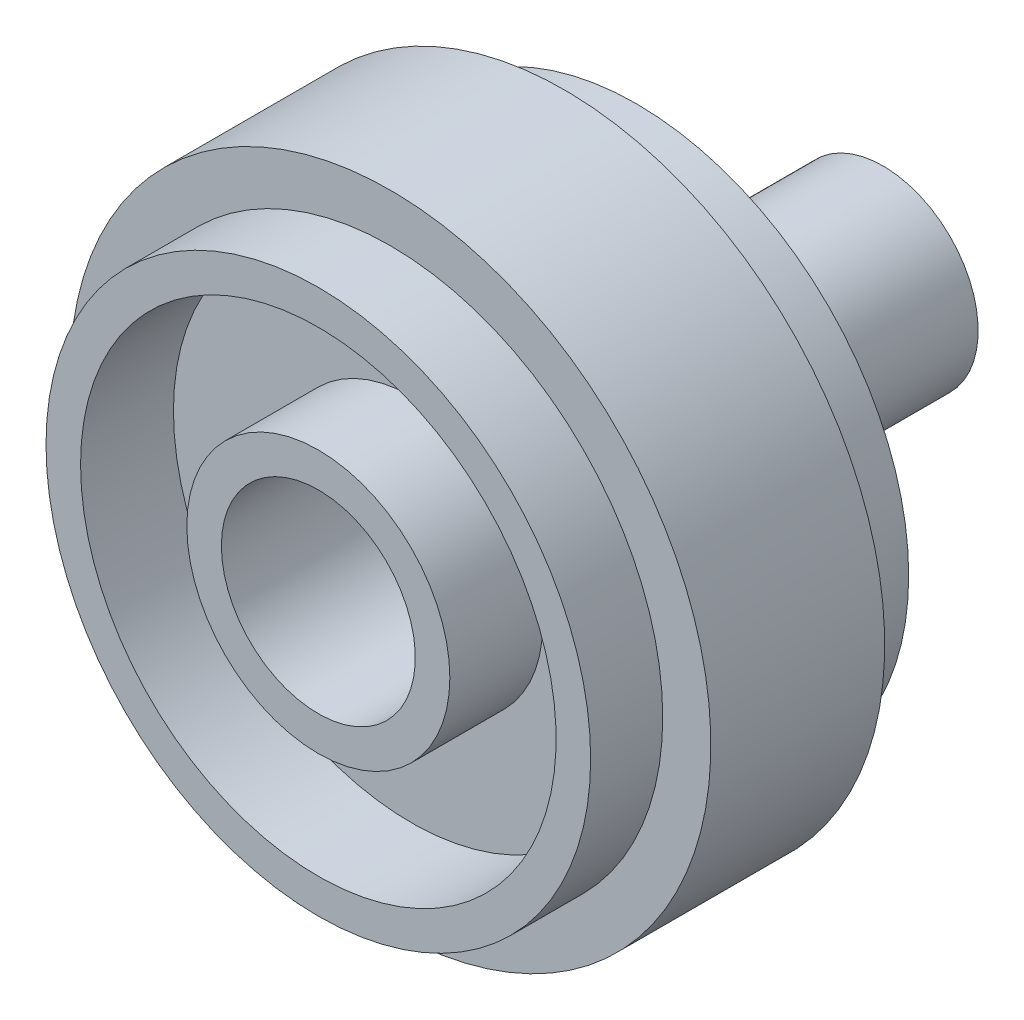
ISO-10303-21;
HEADER;
FILE_DESCRIPTION(('STEP AP214'),'2;1');
FILE_NAME('part.step','',(''),(''),'','','');
FILE_SCHEMA(('AUTOMOTIVE_DESIGN { 1 0 10303 214 1 1 1 1 }'));
ENDSEC;
DATA;
#1=APPLICATION_CONTEXT('core data for automotive mechanical design processes');
#2=APPLICATION_PROTOCOL_DEFINITION('international standard','automotive_design',2000,#1);
#3=PRODUCT_CONTEXT('',#1,'mechanical');
#4=PRODUCT('Part','Part','',(#3));
#5=PRODUCT_RELATED_PRODUCT_CATEGORY('part','',(#4));
#6=PRODUCT_DEFINITION_FORMATION('','',#4);
#7=PRODUCT_DEFINITION_CONTEXT('part definition',#1,'design');
#8=PRODUCT_DEFINITION('design','',#6,#7);
#9=PRODUCT_DEFINITION_SHAPE('','',#8);
#10=(LENGTH_UNIT() NAMED_UNIT(*) SI_UNIT(.MILLI.,.METRE.));
#11=(NAMED_UNIT(*) PLANE_ANGLE_UNIT() SI_UNIT($,.RADIAN.));
#12=(NAMED_UNIT(*) SI_UNIT($,.STERADIAN.) SOLID_ANGLE_UNIT());
#13=UNCERTAINTY_MEASURE_WITH_UNIT(LENGTH_MEASURE(1.E-05),#10,'distance_accuracy_value','');
#14=(GEOMETRIC_REPRESENTATION_CONTEXT(3) GLOBAL_UNCERTAINTY_ASSIGNED_CONTEXT((#13)) GLOBAL_UNIT_ASSIGNED_CONTEXT((#10,
#11,#12)) REPRESENTATION_CONTEXT('',''));
#15=CARTESIAN_POINT('',(0.,0.,0.));
#16=DIRECTION('',(0.,0.,1.));
#17=DIRECTION('',(1.,0.,0.));
#18=AXIS2_PLACEMENT_3D('',#15,#16,#17);
#19=CARTESIAN_POINT('',(0.,9.3091,-2.9718));
#20=DIRECTION('',(0.,0.,-1.));
#21=DIRECTION('',(-1.,0.,0.));
#22=AXIS2_PLACEMENT_3D('',#19,#20,#21);
#23=PLANE('',#22);
#24=CARTESIAN_POINT('',(0.,0.,-2.9718));
#25=DIRECTION('',(0.,0.,-1.));
#26=DIRECTION('',(-1.,0.,0.));
#27=AXIS2_PLACEMENT_3D('',#24,#25,#26);
#28=CIRCLE('',#27,10.95375);
#29=CARTESIAN_POINT('',(-10.95375,0.,-2.9718));
#30=VERTEX_POINT('',#29);
#31=EDGE_CURVE('E10',#30,#30,#28,.T.);
#32=ORIENTED_EDGE('',*,*,#31,.T.);
#33=EDGE_LOOP('',(#32));
#34=FACE_BOUND('',#33,.T.);
#35=CARTESIAN_POINT('',(0.,0.,-2.9718));
#36=DIRECTION('',(0.,0.,-1.));
#37=DIRECTION('',(-1.,0.,0.));
#38=AXIS2_PLACEMENT_3D('',#35,#36,#37);
#39=CIRCLE('',#38,9.3091);
#40=CARTESIAN_POINT('',(-9.3091,0.,-2.9718));
#41=VERTEX_POINT('',#40);
#42=EDGE_CURVE('E95',#41,#41,#39,.T.);
#43=ORIENTED_EDGE('',*,*,#42,.F.);
#44=EDGE_LOOP('',(#43));
#45=FACE_BOUND('',#44,.T.);
#46=ADVANCED_FACE('F31',(#34,#45),#23,.T.);
#47=CARTESIAN_POINT('',(0.,0.,0.));
#48=DIRECTION('',(0.,0.,-1.));
#49=DIRECTION('',(-1.,0.,0.));
#50=AXIS2_PLACEMENT_3D('',#47,#48,#49);
#51=CYLINDRICAL_SURFACE('',#50,10.95375);
#52=CARTESIAN_POINT('',(0.,0.,2.9718));
#53=DIRECTION('',(0.,0.,-1.));
#54=DIRECTION('',(-1.,0.,0.));
#55=AXIS2_PLACEMENT_3D('',#52,#53,#54);
#56=CIRCLE('',#55,10.95375);
#57=CARTESIAN_POINT('',(-10.95375,0.,2.9718));
#58=VERTEX_POINT('',#57);
#59=EDGE_CURVE('E37',#58,#58,#56,.T.);
#60=ORIENTED_EDGE('',*,*,#59,.T.);
#61=EDGE_LOOP('',(#60));
#62=FACE_BOUND('',#61,.T.);
#63=ORIENTED_EDGE('',*,*,#31,.F.);
#64=EDGE_LOOP('',(#63));
#65=FACE_BOUND('',#64,.T.);
#66=ADVANCED_FACE('F103',(#62,#65),#51,.T.);
#67=CARTESIAN_POINT('',(0.,10.95375,2.9718));
#68=DIRECTION('',(0.,0.,1.));
#69=DIRECTION('',(1.,0.,0.));
#70=AXIS2_PLACEMENT_3D('',#67,#68,#69);
#71=PLANE('',#70);
#72=CARTESIAN_POINT('',(0.,0.,2.9718));
#73=DIRECTION('',(0.,0.,-1.));
#74=DIRECTION('',(-1.,0.,0.));
#75=AXIS2_PLACEMENT_3D('',#72,#73,#74);
#76=CIRCLE('',#75,9.3091);
#77=CARTESIAN_POINT('',(-9.3091,0.,2.9718));
#78=VERTEX_POINT('',#77);
#79=EDGE_CURVE('E41',#78,#78,#76,.T.);
#80=ORIENTED_EDGE('',*,*,#79,.T.);
#81=EDGE_LOOP('',(#80));
#82=FACE_BOUND('',#81,.T.);
#83=ORIENTED_EDGE('',*,*,#59,.F.);
#84=EDGE_LOOP('',(#83));
#85=FACE_BOUND('',#84,.T.);
#86=ADVANCED_FACE('F107',(#82,#85),#71,.T.);
#87=CARTESIAN_POINT('',(0.,0.,0.));
#88=DIRECTION('',(0.,0.,-1.));
#89=DIRECTION('',(-1.,0.,0.));
#90=AXIS2_PLACEMENT_3D('',#87,#88,#89);
#91=CYLINDRICAL_SURFACE('',#90,9.3091);
#92=CARTESIAN_POINT('',(0.,0.,5.4356));
#93=DIRECTION('',(0.,0.,-1.));
#94=DIRECTION('',(-1.,0.,0.));
#95=AXIS2_PLACEMENT_3D('',#92,#93,#94);
#96=CIRCLE('',#95,9.3091);
#97=CARTESIAN_POINT('',(-9.3091,0.,5.4356));
#98=VERTEX_POINT('',#97);
#99=EDGE_CURVE('E45',#98,#98,#96,.T.);
#100=ORIENTED_EDGE('',*,*,#99,.T.);
#101=EDGE_LOOP('',(#100));
#102=FACE_BOUND('',#101,.T.);
#103=ORIENTED_EDGE('',*,*,#79,.F.);
#104=EDGE_LOOP('',(#103));
#105=FACE_BOUND('',#104,.T.);
#106=ADVANCED_FACE('F111',(#102,#105),#91,.T.);
#107=CARTESIAN_POINT('',(0.,9.3091,5.4356));
#108=DIRECTION('',(0.,0.,1.));
#109=DIRECTION('',(1.,0.,0.));
#110=AXIS2_PLACEMENT_3D('',#107,#108,#109);
#111=PLANE('',#110);
#112=CARTESIAN_POINT('',(0.,0.,5.4356));
#113=DIRECTION('',(0.,0.,-1.));
#114=DIRECTION('',(-1.,0.,0.));
#115=AXIS2_PLACEMENT_3D('',#112,#113,#114);
#116=CIRCLE('',#115,8.128);
#117=CARTESIAN_POINT('',(-8.128,0.,5.4356));
#118=VERTEX_POINT('',#117);
#119=EDGE_CURVE('E50',#118,#118,#116,.T.);
#120=ORIENTED_EDGE('',*,*,#119,.T.);
#121=EDGE_LOOP('',(#120));
#122=FACE_BOUND('',#121,.T.);
#123=ORIENTED_EDGE('',*,*,#99,.F.);
#124=EDGE_LOOP('',(#123));
#125=FACE_BOUND('',#124,.T.);
#126=ADVANCED_FACE('F118',(#122,#125),#111,.T.);
#127=CARTESIAN_POINT('',(0.,0.,0.));
#128=DIRECTION('',(0.,0.,-1.));
#129=DIRECTION('',(-1.,0.,0.));
#130=AXIS2_PLACEMENT_3D('',#127,#128,#129);
#131=CYLINDRICAL_SURFACE('',#130,8.128);
#132=CARTESIAN_POINT('',(0.,0.,2.2606));
#133=DIRECTION('',(0.,0.,-1.));
#134=DIRECTION('',(-1.,0.,0.));
#135=AXIS2_PLACEMENT_3D('',#132,#133,#134);
#136=CIRCLE('',#135,8.128);
#137=CARTESIAN_POINT('',(-8.128,0.,2.2606));
#138=VERTEX_POINT('',#137);
#139=EDGE_CURVE('E53',#138,#138,#136,.T.);
#140=ORIENTED_EDGE('',*,*,#139,.T.);
#141=EDGE_LOOP('',(#140));
#142=FACE_BOUND('',#141,.T.);
#143=ORIENTED_EDGE('',*,*,#119,.F.);
#144=EDGE_LOOP('',(#143));
#145=FACE_BOUND('',#144,.T.);
#146=ADVANCED_FACE('F122',(#142,#145),#131,.F.);
#147=CARTESIAN_POINT('',(0.,8.128,2.2606));
#148=DIRECTION('',(0.,0.,1.));
#149=DIRECTION('',(1.,0.,0.));
#150=AXIS2_PLACEMENT_3D('',#147,#148,#149);
#151=PLANE('',#150);
#152=CARTESIAN_POINT('',(0.,0.,2.2606));
#153=DIRECTION('',(0.,0.,-1.));
#154=DIRECTION('',(-1.,0.,0.));
#155=AXIS2_PLACEMENT_3D('',#152,#153,#154);
#156=CIRCLE('',#155,4.4958);
#157=CARTESIAN_POINT('',(-4.4958,0.,2.2606));
#158=VERTEX_POINT('',#157);
#159=EDGE_CURVE('E56',#158,#158,#156,.T.);
#160=ORIENTED_EDGE('',*,*,#159,.T.);
#161=EDGE_LOOP('',(#160));
#162=FACE_BOUND('',#161,.T.);
#163=ORIENTED_EDGE('',*,*,#139,.F.);
#164=EDGE_LOOP('',(#163));
#165=FACE_BOUND('',#164,.T.);
#166=ADVANCED_FACE('F126',(#162,#165),#151,.T.);
#167=CARTESIAN_POINT('',(0.,0.,0.));
#168=DIRECTION('',(0.,0.,-1.));
#169=DIRECTION('',(-1.,0.,0.));
#170=AXIS2_PLACEMENT_3D('',#167,#168,#169);
#171=CYLINDRICAL_SURFACE('',#170,4.4958);
#172=CARTESIAN_POINT('',(0.,0.,5.4356));
#173=DIRECTION('',(0.,0.,-1.));
#174=DIRECTION('',(-1.,0.,0.));
#175=AXIS2_PLACEMENT_3D('',#172,#173,#174);
#176=CIRCLE('',#175,4.4958);
#177=CARTESIAN_POINT('',(-4.4958,0.,5.4356));
#178=VERTEX_POINT('',#177);
#179=EDGE_CURVE('E59',#178,#178,#176,.T.);
#180=ORIENTED_EDGE('',*,*,#179,.T.);
#181=EDGE_LOOP('',(#180));
#182=FACE_BOUND('',#181,.T.);
#183=ORIENTED_EDGE('',*,*,#159,.F.);
#184=EDGE_LOOP('',(#183));
#185=FACE_BOUND('',#184,.T.);
#186=ADVANCED_FACE('F130',(#182,#185),#171,.T.);
#187=CARTESIAN_POINT('',(0.,4.4958,5.4356));
#188=DIRECTION('',(0.,0.,1.));
#189=DIRECTION('',(1.,0.,0.));
#190=AXIS2_PLACEMENT_3D('',#187,#188,#189);
#191=PLANE('',#190);
#192=CARTESIAN_POINT('',(0.,0.,5.4356));
#193=DIRECTION('',(0.,0.,-1.));
#194=DIRECTION('',(-1.,0.,0.));
#195=AXIS2_PLACEMENT_3D('',#192,#193,#194);
#196=CIRCLE('',#195,3.3147);
#197=CARTESIAN_POINT('',(-3.3147,0.,5.4356));
#198=VERTEX_POINT('',#197);
#199=EDGE_CURVE('E62',#198,#198,#196,.T.);
#200=ORIENTED_EDGE('',*,*,#199,.T.);
#201=EDGE_LOOP('',(#200));
#202=FACE_BOUND('',#201,.T.);
#203=ORIENTED_EDGE('',*,*,#179,.F.);
#204=EDGE_LOOP('',(#203));
#205=FACE_BOUND('',#204,.T.);
#206=ADVANCED_FACE('F134',(#202,#205),#191,.T.);
#207=CARTESIAN_POINT('',(0.,0.,0.));
#208=DIRECTION('',(0.,0.,-1.));
#209=DIRECTION('',(-1.,0.,0.));
#210=AXIS2_PLACEMENT_3D('',#207,#208,#209);
#211=CYLINDRICAL_SURFACE('',#210,3.3147);
#212=CARTESIAN_POINT('',(0.,0.,-1.1938));
#213=DIRECTION('',(0.,0.,-1.));
#214=DIRECTION('',(-1.,0.,0.));
#215=AXIS2_PLACEMENT_3D('',#212,#213,#214);
#216=CIRCLE('',#215,3.3147);
#217=CARTESIAN_POINT('',(-3.3147,0.,-1.1938));
#218=VERTEX_POINT('',#217);
#219=EDGE_CURVE('E65',#218,#218,#216,.T.);
#220=ORIENTED_EDGE('',*,*,#219,.T.);
#221=EDGE_LOOP('',(#220));
#222=FACE_BOUND('',#221,.T.);
#223=ORIENTED_EDGE('',*,*,#199,.F.);
#224=EDGE_LOOP('',(#223));
#225=FACE_BOUND('',#224,.T.);
#226=ADVANCED_FACE('F138',(#222,#225),#211,.F.);
#227=CARTESIAN_POINT('',(0.,3.3147,-1.1938));
#228=DIRECTION('',(0.,0.,1.));
#229=DIRECTION('',(1.,0.,0.));
#230=AXIS2_PLACEMENT_3D('',#227,#228,#229);
#231=PLANE('',#230);
#232=CARTESIAN_POINT('',(0.,0.,-1.1938));
#233=DIRECTION('',(0.,0.,-1.));
#234=DIRECTION('',(-1.,0.,0.));
#235=AXIS2_PLACEMENT_3D('',#232,#233,#234);
#236=CIRCLE('',#235,1.55575);
#237=CARTESIAN_POINT('',(-1.55575,0.,-1.1938));
#238=VERTEX_POINT('',#237);
#239=EDGE_CURVE('E68',#238,#238,#236,.T.);
#240=ORIENTED_EDGE('',*,*,#239,.T.);
#241=EDGE_LOOP('',(#240));
#242=FACE_BOUND('',#241,.T.);
#243=ORIENTED_EDGE('',*,*,#219,.F.);
#244=EDGE_LOOP('',(#243));
#245=FACE_BOUND('',#244,.T.);
#246=ADVANCED_FACE('F142',(#242,#245),#231,.T.);
#247=CARTESIAN_POINT('',(0.,0.,0.));
#248=DIRECTION('',(0.,0.,-1.));
#249=DIRECTION('',(-1.,0.,0.));
#250=AXIS2_PLACEMENT_3D('',#247,#248,#249);
#251=CYLINDRICAL_SURFACE('',#250,1.55575);
#252=CARTESIAN_POINT('',(0.,0.,-13.8684));
#253=DIRECTION('',(0.,0.,-1.));
#254=DIRECTION('',(-1.,0.,0.));
#255=AXIS2_PLACEMENT_3D('',#252,#253,#254);
#256=CIRCLE('',#255,1.55575);
#257=CARTESIAN_POINT('',(-1.55575,0.,-13.8684));
#258=VERTEX_POINT('',#257);
#259=EDGE_CURVE('E71',#258,#258,#256,.T.);
#260=ORIENTED_EDGE('',*,*,#259,.T.);
#261=EDGE_LOOP('',(#260));
#262=FACE_BOUND('',#261,.T.);
#263=ORIENTED_EDGE('',*,*,#239,.F.);
#264=EDGE_LOOP('',(#263));
#265=FACE_BOUND('',#264,.T.);
#266=ADVANCED_FACE('F146',(#262,#265),#251,.F.);
#267=CARTESIAN_POINT('',(0.,1.55575,-13.8684));
#268=DIRECTION('',(0.,0.,-1.));
#269=DIRECTION('',(-1.,0.,0.));
#270=AXIS2_PLACEMENT_3D('',#267,#268,#269);
#271=PLANE('',#270);
#272=CARTESIAN_POINT('',(0.,0.,-13.8684));
#273=DIRECTION('',(0.,0.,-1.));
#274=DIRECTION('',(-1.,0.,0.));
#275=AXIS2_PLACEMENT_3D('',#272,#273,#274);
#276=CIRCLE('',#275,3.2512);
#277=CARTESIAN_POINT('',(-3.2512,0.,-13.8684));
#278=VERTEX_POINT('',#277);
#279=EDGE_CURVE('E74',#278,#278,#276,.T.);
#280=ORIENTED_EDGE('',*,*,#279,.T.);
#281=EDGE_LOOP('',(#280));
#282=FACE_BOUND('',#281,.T.);
#283=ORIENTED_EDGE('',*,*,#259,.F.);
#284=EDGE_LOOP('',(#283));
#285=FACE_BOUND('',#284,.T.);
#286=ADVANCED_FACE('F150',(#282,#285),#271,.T.);
#287=CARTESIAN_POINT('',(0.,0.,0.));
#288=DIRECTION('',(0.,0.,-1.));
#289=DIRECTION('',(-1.,0.,0.));
#290=AXIS2_PLACEMENT_3D('',#287,#288,#289);
#291=CYLINDRICAL_SURFACE('',#290,3.2512);
#292=CARTESIAN_POINT('',(0.,0.,-2.2225));
#293=DIRECTION('',(0.,0.,-1.));
#294=DIRECTION('',(-1.,0.,0.));
#295=AXIS2_PLACEMENT_3D('',#292,#293,#294);
#296=CIRCLE('',#295,3.2512);
#297=CARTESIAN_POINT('',(-3.2512,0.,-2.2225));
#298=VERTEX_POINT('',#297);
#299=EDGE_CURVE('E77',#298,#298,#296,.T.);
#300=ORIENTED_EDGE('',*,*,#299,.T.);
#301=EDGE_LOOP('',(#300));
#302=FACE_BOUND('',#301,.T.);
#303=ORIENTED_EDGE('',*,*,#279,.F.);
#304=EDGE_LOOP('',(#303));
#305=FACE_BOUND('',#304,.T.);
#306=ADVANCED_FACE('F154',(#302,#305),#291,.T.);
#307=CARTESIAN_POINT('',(0.,3.2512,-2.2225));
#308=DIRECTION('',(0.,0.,-1.));
#309=DIRECTION('',(-1.,0.,0.));
#310=AXIS2_PLACEMENT_3D('',#307,#308,#309);
#311=PLANE('',#310);
#312=CARTESIAN_POINT('',(0.,0.,-2.2225));
#313=DIRECTION('',(0.,0.,-1.));
#314=DIRECTION('',(-1.,0.,0.));
#315=AXIS2_PLACEMENT_3D('',#312,#313,#314);
#316=CIRCLE('',#315,4.4958);
#317=CARTESIAN_POINT('',(-4.4958,0.,-2.2225));
#318=VERTEX_POINT('',#317);
#319=EDGE_CURVE('E80',#318,#318,#316,.T.);
#320=ORIENTED_EDGE('',*,*,#319,.T.);
#321=EDGE_LOOP('',(#320));
#322=FACE_BOUND('',#321,.T.);
#323=ORIENTED_EDGE('',*,*,#299,.F.);
#324=EDGE_LOOP('',(#323));
#325=FACE_BOUND('',#324,.T.);
#326=ADVANCED_FACE('F158',(#322,#325),#311,.T.);
#327=CARTESIAN_POINT('',(0.,0.,0.));
#328=DIRECTION('',(0.,0.,-1.));
#329=DIRECTION('',(-1.,0.,0.));
#330=AXIS2_PLACEMENT_3D('',#327,#328,#329);
#331=CYLINDRICAL_SURFACE('',#330,4.4958);
#332=CARTESIAN_POINT('',(0.,0.,0.5207));
#333=DIRECTION('',(0.,0.,-1.));
#334=DIRECTION('',(-1.,0.,0.));
#335=AXIS2_PLACEMENT_3D('',#332,#333,#334);
#336=CIRCLE('',#335,4.4958);
#337=CARTESIAN_POINT('',(-4.4958,0.,0.5207));
#338=VERTEX_POINT('',#337);
#339=EDGE_CURVE('E83',#338,#338,#336,.T.);
#340=ORIENTED_EDGE('',*,*,#339,.T.);
#341=EDGE_LOOP('',(#340));
#342=FACE_BOUND('',#341,.T.);
#343=ORIENTED_EDGE('',*,*,#319,.F.);
#344=EDGE_LOOP('',(#343));
#345=FACE_BOUND('',#344,.T.);
#346=ADVANCED_FACE('F162',(#342,#345),#331,.T.);
#347=CARTESIAN_POINT('',(0.,4.4958,0.5207));
#348=DIRECTION('',(0.,0.,-1.));
#349=DIRECTION('',(-1.,0.,0.));
#350=AXIS2_PLACEMENT_3D('',#347,#348,#349);
#351=PLANE('',#350);
#352=CARTESIAN_POINT('',(0.,0.,0.5207));
#353=DIRECTION('',(0.,0.,-1.));
#354=DIRECTION('',(-1.,0.,0.));
#355=AXIS2_PLACEMENT_3D('',#352,#353,#354);
#356=CIRCLE('',#355,8.128);
#357=CARTESIAN_POINT('',(-8.128,0.,0.5207));
#358=VERTEX_POINT('',#357);
#359=EDGE_CURVE('E86',#358,#358,#356,.T.);
#360=ORIENTED_EDGE('',*,*,#359,.T.);
#361=EDGE_LOOP('',(#360));
#362=FACE_BOUND('',#361,.T.);
#363=ORIENTED_EDGE('',*,*,#339,.F.);
#364=EDGE_LOOP('',(#363));
#365=FACE_BOUND('',#364,.T.);
#366=ADVANCED_FACE('F166',(#362,#365),#351,.T.);
#367=CARTESIAN_POINT('',(0.,0.,0.));
#368=DIRECTION('',(0.,0.,-1.));
#369=DIRECTION('',(-1.,0.,0.));
#370=AXIS2_PLACEMENT_3D('',#367,#368,#369);
#371=CYLINDRICAL_SURFACE('',#370,8.128);
#372=CARTESIAN_POINT('',(0.,0.,-5.4356));
#373=DIRECTION('',(0.,0.,-1.));
#374=DIRECTION('',(-1.,0.,0.));
#375=AXIS2_PLACEMENT_3D('',#372,#373,#374);
#376=CIRCLE('',#375,8.128);
#377=CARTESIAN_POINT('',(-8.128,0.,-5.4356));
#378=VERTEX_POINT('',#377);
#379=EDGE_CURVE('E89',#378,#378,#376,.T.);
#380=ORIENTED_EDGE('',*,*,#379,.T.);
#381=EDGE_LOOP('',(#380));
#382=FACE_BOUND('',#381,.T.);
#383=ORIENTED_EDGE('',*,*,#359,.F.);
#384=EDGE_LOOP('',(#383));
#385=FACE_BOUND('',#384,.T.);
#386=ADVANCED_FACE('F170',(#382,#385),#371,.F.);
#387=CARTESIAN_POINT('',(0.,8.128,-5.4356));
#388=DIRECTION('',(0.,0.,-1.));
#389=DIRECTION('',(-1.,0.,0.));
#390=AXIS2_PLACEMENT_3D('',#387,#388,#389);
#391=PLANE('',#390);
#392=CARTESIAN_POINT('',(0.,0.,-5.4356));
#393=DIRECTION('',(0.,0.,-1.));
#394=DIRECTION('',(-1.,0.,0.));
#395=AXIS2_PLACEMENT_3D('',#392,#393,#394);
#396=CIRCLE('',#395,9.3091);
#397=CARTESIAN_POINT('',(-9.3091,0.,-5.4356));
#398=VERTEX_POINT('',#397);
#399=EDGE_CURVE('E92',#398,#398,#396,.T.);
#400=ORIENTED_EDGE('',*,*,#399,.T.);
#401=EDGE_LOOP('',(#400));
#402=FACE_BOUND('',#401,.T.);
#403=ORIENTED_EDGE('',*,*,#379,.F.);
#404=EDGE_LOOP('',(#403));
#405=FACE_BOUND('',#404,.T.);
#406=ADVANCED_FACE('F174',(#402,#405),#391,.T.);
#407=CARTESIAN_POINT('',(0.,0.,0.));
#408=DIRECTION('',(0.,0.,-1.));
#409=DIRECTION('',(-1.,0.,0.));
#410=AXIS2_PLACEMENT_3D('',#407,#408,#409);
#411=CYLINDRICAL_SURFACE('',#410,9.3091);
#412=ORIENTED_EDGE('',*,*,#42,.T.);
#413=EDGE_LOOP('',(#412));
#414=FACE_BOUND('',#413,.T.);
#415=ORIENTED_EDGE('',*,*,#399,.F.);
#416=EDGE_LOOP('',(#415));
#417=FACE_BOUND('',#416,.T.);
#418=ADVANCED_FACE('F99',(#414,#417),#411,.T.);
#419=CLOSED_SHELL('',(#46,#66,#86,#106,#126,#146,#166,#186,#206,#226,#246,#266,#286,#306,#326,
#346,#366,#386,#406,#418));
#420=MANIFOLD_SOLID_BREP('B2',#419);
#421=ADVANCED_BREP_SHAPE_REPRESENTATION('',(#18,#420),#14);
#422=SHAPE_DEFINITION_REPRESENTATION(#9,#421);
ENDSEC;
END-ISO-10303-21;
